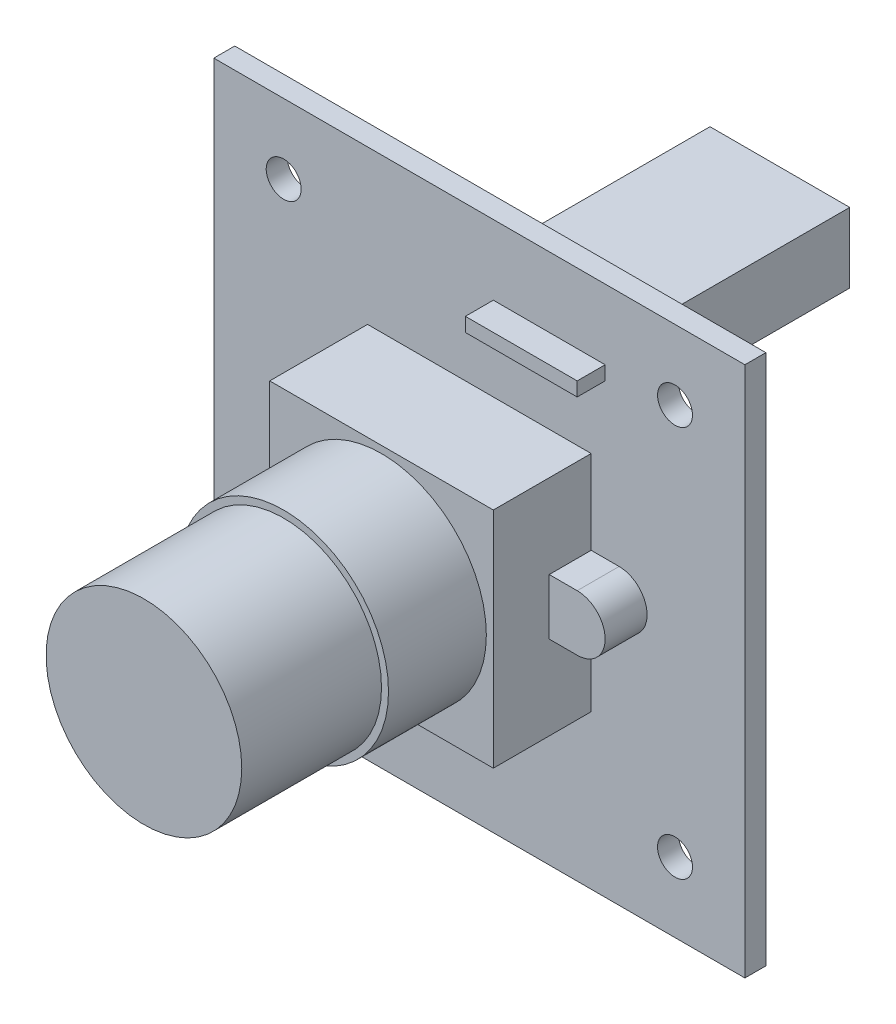
ISO-10303-21;
HEADER;
FILE_DESCRIPTION(('STEP AP214'),'2;1');
FILE_NAME('part.step','',(''),(''),'','','');
FILE_SCHEMA(('AUTOMOTIVE_DESIGN { 1 0 10303 214 1 1 1 1 }'));
ENDSEC;
DATA;
#1=APPLICATION_CONTEXT('core data for automotive mechanical design processes');
#2=APPLICATION_PROTOCOL_DEFINITION('international standard','automotive_design',2000,#1);
#3=PRODUCT_CONTEXT('',#1,'mechanical');
#4=PRODUCT('Part','Part','',(#3));
#5=PRODUCT_RELATED_PRODUCT_CATEGORY('part','',(#4));
#6=PRODUCT_DEFINITION_FORMATION('','',#4);
#7=PRODUCT_DEFINITION_CONTEXT('part definition',#1,'design');
#8=PRODUCT_DEFINITION('design','',#6,#7);
#9=PRODUCT_DEFINITION_SHAPE('','',#8);
#10=(LENGTH_UNIT() NAMED_UNIT(*) SI_UNIT(.MILLI.,.METRE.));
#11=(NAMED_UNIT(*) PLANE_ANGLE_UNIT() SI_UNIT($,.RADIAN.));
#12=(NAMED_UNIT(*) SI_UNIT($,.STERADIAN.) SOLID_ANGLE_UNIT());
#13=UNCERTAINTY_MEASURE_WITH_UNIT(LENGTH_MEASURE(1.E-05),#10,'distance_accuracy_value','');
#14=(GEOMETRIC_REPRESENTATION_CONTEXT(3) GLOBAL_UNCERTAINTY_ASSIGNED_CONTEXT((#13)) GLOBAL_UNIT_ASSIGNED_CONTEXT((#10,
#11,#12)) REPRESENTATION_CONTEXT('',''));
#15=CARTESIAN_POINT('',(0.,0.,0.));
#16=DIRECTION('',(0.,0.,1.));
#17=DIRECTION('',(1.,0.,0.));
#18=AXIS2_PLACEMENT_3D('',#15,#16,#17);
#19=CARTESIAN_POINT('',(0.,0.,1.5));
#20=DIRECTION('',(0.,0.,-1.));
#21=DIRECTION('',(-1.,0.,0.));
#22=AXIS2_PLACEMENT_3D('',#19,#20,#21);
#23=PLANE('',#22);
#24=DIRECTION('',(-1.,0.,0.));
#25=VECTOR('',#24,1.);
#26=CARTESIAN_POINT('',(10.,2.,1.5));
#27=LINE('',#26,#25);
#28=CARTESIAN_POINT('',(-8.,2.,1.5));
#29=VERTEX_POINT('',#28);
#30=CARTESIAN_POINT('',(-10.,2.,1.5));
#31=VERTEX_POINT('',#30);
#32=EDGE_CURVE('E272',#29,#31,#27,.T.);
#33=ORIENTED_EDGE('',*,*,#32,.F.);
#34=DIRECTION('',(0.,-1.,0.));
#35=VECTOR('',#34,1.);
#36=CARTESIAN_POINT('',(-8.,-8.,1.5));
#37=LINE('',#36,#35);
#38=CARTESIAN_POINT('',(-8.,8.,1.5));
#39=VERTEX_POINT('',#38);
#40=EDGE_CURVE('E315',#39,#29,#37,.T.);
#41=ORIENTED_EDGE('',*,*,#40,.F.);
#42=DIRECTION('',(-1.,0.,0.));
#43=VECTOR('',#42,1.);
#44=CARTESIAN_POINT('',(8.,8.,1.5));
#45=LINE('',#44,#43);
#46=CARTESIAN_POINT('',(8.,8.,1.5));
#47=VERTEX_POINT('',#46);
#48=EDGE_CURVE('E308',#47,#39,#45,.T.);
#49=ORIENTED_EDGE('',*,*,#48,.F.);
#50=DIRECTION('',(0.,1.,0.));
#51=VECTOR('',#50,1.);
#52=CARTESIAN_POINT('',(8.,-8.,1.5));
#53=LINE('',#52,#51);
#54=CARTESIAN_POINT('',(8.,2.,1.5));
#55=VERTEX_POINT('',#54);
#56=EDGE_CURVE('E321',#55,#47,#53,.T.);
#57=ORIENTED_EDGE('',*,*,#56,.F.);
#58=CARTESIAN_POINT('',(10.,2.,1.5));
#59=VERTEX_POINT('',#58);
#60=EDGE_CURVE('E273',#59,#55,#27,.T.);
#61=ORIENTED_EDGE('',*,*,#60,.F.);
#62=CARTESIAN_POINT('',(10.,0.,1.5));
#63=DIRECTION('',(0.,0.,1.));
#64=DIRECTION('',(1.,0.,0.));
#65=AXIS2_PLACEMENT_3D('',#62,#63,#64);
#66=CIRCLE('',#65,2.);
#67=CARTESIAN_POINT('',(10.,-2.,1.5));
#68=VERTEX_POINT('',#67);
#69=EDGE_CURVE('E256',#68,#59,#66,.T.);
#70=ORIENTED_EDGE('',*,*,#69,.F.);
#71=DIRECTION('',(1.,0.,0.));
#72=VECTOR('',#71,1.);
#73=CARTESIAN_POINT('',(10.,-2.,1.5));
#74=LINE('',#73,#72);
#75=CARTESIAN_POINT('',(8.,-2.,1.5));
#76=VERTEX_POINT('',#75);
#77=EDGE_CURVE('E277',#76,#68,#74,.T.);
#78=ORIENTED_EDGE('',*,*,#77,.F.);
#79=CARTESIAN_POINT('',(8.,-8.,1.5));
#80=VERTEX_POINT('',#79);
#81=EDGE_CURVE('E322',#80,#76,#53,.T.);
#82=ORIENTED_EDGE('',*,*,#81,.F.);
#83=DIRECTION('',(1.,0.,0.));
#84=VECTOR('',#83,1.);
#85=CARTESIAN_POINT('',(8.,-8.,1.5));
#86=LINE('',#85,#84);
#87=CARTESIAN_POINT('',(-8.,-8.,1.5));
#88=VERTEX_POINT('',#87);
#89=EDGE_CURVE('E318',#88,#80,#86,.T.);
#90=ORIENTED_EDGE('',*,*,#89,.F.);
#91=CARTESIAN_POINT('',(-8.,-2.,1.5));
#92=VERTEX_POINT('',#91);
#93=EDGE_CURVE('E301',#92,#88,#37,.T.);
#94=ORIENTED_EDGE('',*,*,#93,.F.);
#95=CARTESIAN_POINT('',(-10.,-2.,1.5));
#96=VERTEX_POINT('',#95);
#97=EDGE_CURVE('E261',#96,#92,#74,.T.);
#98=ORIENTED_EDGE('',*,*,#97,.F.);
#99=CARTESIAN_POINT('',(-10.,0.,1.5));
#100=DIRECTION('',(0.,0.,1.));
#101=DIRECTION('',(1.,0.,0.));
#102=AXIS2_PLACEMENT_3D('',#99,#100,#101);
#103=CIRCLE('',#102,2.);
#104=EDGE_CURVE('E275',#31,#96,#103,.T.);
#105=ORIENTED_EDGE('',*,*,#104,.F.);
#106=EDGE_LOOP('',(#33,#41,#49,#57,#61,#70,#78,#82,#90,#94,#98,#105));
#107=FACE_BOUND('',#106,.T.);
#108=DIRECTION('',(0.,1.,0.));
#109=VECTOR('',#108,1.);
#110=CARTESIAN_POINT('',(19.,-19.,1.5));
#111=LINE('',#110,#109);
#112=CARTESIAN_POINT('',(19.,-19.,1.5));
#113=VERTEX_POINT('',#112);
#114=CARTESIAN_POINT('',(19.,19.,1.5));
#115=VERTEX_POINT('',#114);
#116=EDGE_CURVE('E363',#113,#115,#111,.T.);
#117=ORIENTED_EDGE('',*,*,#116,.T.);
#118=DIRECTION('',(-1.,0.,0.));
#119=VECTOR('',#118,1.);
#120=CARTESIAN_POINT('',(-19.,19.,1.5));
#121=LINE('',#120,#119);
#122=CARTESIAN_POINT('',(-19.,19.,1.5));
#123=VERTEX_POINT('',#122);
#124=EDGE_CURVE('E366',#115,#123,#121,.T.);
#125=ORIENTED_EDGE('',*,*,#124,.T.);
#126=DIRECTION('',(0.,-1.,0.));
#127=VECTOR('',#126,1.);
#128=CARTESIAN_POINT('',(-19.,-19.,1.5));
#129=LINE('',#128,#127);
#130=CARTESIAN_POINT('',(-19.,-19.,1.5));
#131=VERTEX_POINT('',#130);
#132=EDGE_CURVE('E369',#123,#131,#129,.T.);
#133=ORIENTED_EDGE('',*,*,#132,.T.);
#134=DIRECTION('',(1.,0.,0.));
#135=VECTOR('',#134,1.);
#136=CARTESIAN_POINT('',(-19.,-19.,1.5));
#137=LINE('',#136,#135);
#138=EDGE_CURVE('E371',#131,#113,#137,.T.);
#139=ORIENTED_EDGE('',*,*,#138,.T.);
#140=EDGE_LOOP('',(#117,#125,#133,#139));
#141=FACE_BOUND('',#140,.T.);
#142=CARTESIAN_POINT('',(-14.,14.,1.5));
#143=DIRECTION('',(0.,0.,1.));
#144=DIRECTION('',(1.,0.,0.));
#145=AXIS2_PLACEMENT_3D('',#142,#143,#144);
#146=CIRCLE('',#145,1.25);
#147=CARTESIAN_POINT('',(-12.75,14.,1.5));
#148=VERTEX_POINT('',#147);
#149=EDGE_CURVE('E357',#148,#148,#146,.T.);
#150=ORIENTED_EDGE('',*,*,#149,.F.);
#151=EDGE_LOOP('',(#150));
#152=FACE_BOUND('',#151,.T.);
#153=CARTESIAN_POINT('',(14.,14.,1.5));
#154=DIRECTION('',(0.,0.,1.));
#155=DIRECTION('',(1.,0.,0.));
#156=AXIS2_PLACEMENT_3D('',#153,#154,#155);
#157=CIRCLE('',#156,1.25);
#158=CARTESIAN_POINT('',(15.25,14.,1.5));
#159=VERTEX_POINT('',#158);
#160=EDGE_CURVE('E351',#159,#159,#157,.T.);
#161=ORIENTED_EDGE('',*,*,#160,.F.);
#162=EDGE_LOOP('',(#161));
#163=FACE_BOUND('',#162,.T.);
#164=CARTESIAN_POINT('',(14.,-14.,1.5));
#165=DIRECTION('',(0.,0.,1.));
#166=DIRECTION('',(1.,0.,0.));
#167=AXIS2_PLACEMENT_3D('',#164,#165,#166);
#168=CIRCLE('',#167,1.25);
#169=CARTESIAN_POINT('',(15.25,-14.,1.5));
#170=VERTEX_POINT('',#169);
#171=EDGE_CURVE('E345',#170,#170,#168,.T.);
#172=ORIENTED_EDGE('',*,*,#171,.F.);
#173=EDGE_LOOP('',(#172));
#174=FACE_BOUND('',#173,.T.);
#175=CARTESIAN_POINT('',(-14.,-14.,1.5));
#176=DIRECTION('',(0.,0.,1.));
#177=DIRECTION('',(1.,0.,0.));
#178=AXIS2_PLACEMENT_3D('',#175,#176,#177);
#179=CIRCLE('',#178,1.25);
#180=CARTESIAN_POINT('',(-12.75,-14.,1.5));
#181=VERTEX_POINT('',#180);
#182=EDGE_CURVE('E339',#181,#181,#179,.T.);
#183=ORIENTED_EDGE('',*,*,#182,.F.);
#184=EDGE_LOOP('',(#183));
#185=FACE_BOUND('',#184,.T.);
#186=DIRECTION('',(0.,-1.,0.));
#187=VECTOR('',#186,1.);
#188=CARTESIAN_POINT('',(1.00000000000001,14.,1.5));
#189=LINE('',#188,#187);
#190=CARTESIAN_POINT('',(1.00000000000001,14.,1.5));
#191=VERTEX_POINT('',#190);
#192=CARTESIAN_POINT('',(1.00000000000001,13.,1.5));
#193=VERTEX_POINT('',#192);
#194=EDGE_CURVE('E218',#191,#193,#189,.T.);
#195=ORIENTED_EDGE('',*,*,#194,.F.);
#196=DIRECTION('',(-1.,0.,0.));
#197=VECTOR('',#196,1.);
#198=CARTESIAN_POINT('',(9.00000000000001,14.,1.5));
#199=LINE('',#198,#197);
#200=CARTESIAN_POINT('',(9.00000000000001,14.,1.5));
#201=VERTEX_POINT('',#200);
#202=EDGE_CURVE('E215',#201,#191,#199,.T.);
#203=ORIENTED_EDGE('',*,*,#202,.F.);
#204=DIRECTION('',(0.,1.,0.));
#205=VECTOR('',#204,1.);
#206=CARTESIAN_POINT('',(9.00000000000001,14.,1.5));
#207=LINE('',#206,#205);
#208=CARTESIAN_POINT('',(9.00000000000001,13.,1.5));
#209=VERTEX_POINT('',#208);
#210=EDGE_CURVE('E57',#209,#201,#207,.T.);
#211=ORIENTED_EDGE('',*,*,#210,.F.);
#212=DIRECTION('',(1.,0.,0.));
#213=VECTOR('',#212,1.);
#214=CARTESIAN_POINT('',(9.00000000000001,13.,1.5));
#215=LINE('',#214,#213);
#216=EDGE_CURVE('E52',#193,#209,#215,.T.);
#217=ORIENTED_EDGE('',*,*,#216,.F.);
#218=EDGE_LOOP('',(#195,#203,#211,#217));
#219=FACE_BOUND('',#218,.T.);
#220=ADVANCED_FACE('F36',(#107,#141,#152,#163,#174,#185,#219),#23,.F.);
#221=CARTESIAN_POINT('',(0.,0.,0.));
#222=DIRECTION('',(0.,0.,-1.));
#223=DIRECTION('',(-1.,0.,0.));
#224=AXIS2_PLACEMENT_3D('',#221,#222,#223);
#225=PLANE('',#224);
#226=CARTESIAN_POINT('',(14.,-14.,0.));
#227=DIRECTION('',(0.,0.,1.));
#228=DIRECTION('',(1.,0.,0.));
#229=AXIS2_PLACEMENT_3D('',#226,#227,#228);
#230=CIRCLE('',#229,1.25);
#231=CARTESIAN_POINT('',(15.25,-14.,0.));
#232=VERTEX_POINT('',#231);
#233=EDGE_CURVE('E342',#232,#232,#230,.T.);
#234=ORIENTED_EDGE('',*,*,#233,.T.);
#235=EDGE_LOOP('',(#234));
#236=FACE_BOUND('',#235,.T.);
#237=CARTESIAN_POINT('',(-14.,14.,0.));
#238=DIRECTION('',(0.,0.,1.));
#239=DIRECTION('',(1.,0.,0.));
#240=AXIS2_PLACEMENT_3D('',#237,#238,#239);
#241=CIRCLE('',#240,1.25);
#242=CARTESIAN_POINT('',(-12.75,14.,0.));
#243=VERTEX_POINT('',#242);
#244=EDGE_CURVE('E354',#243,#243,#241,.T.);
#245=ORIENTED_EDGE('',*,*,#244,.T.);
#246=EDGE_LOOP('',(#245));
#247=FACE_BOUND('',#246,.T.);
#248=DIRECTION('',(0.,1.,0.));
#249=VECTOR('',#248,1.);
#250=CARTESIAN_POINT('',(19.,-19.,0.));
#251=LINE('',#250,#249);
#252=CARTESIAN_POINT('',(19.,-19.,0.));
#253=VERTEX_POINT('',#252);
#254=CARTESIAN_POINT('',(19.,19.,0.));
#255=VERTEX_POINT('',#254);
#256=EDGE_CURVE('E360',#253,#255,#251,.T.);
#257=ORIENTED_EDGE('',*,*,#256,.F.);
#258=DIRECTION('',(1.,0.,0.));
#259=VECTOR('',#258,1.);
#260=CARTESIAN_POINT('',(-19.,-19.,0.));
#261=LINE('',#260,#259);
#262=CARTESIAN_POINT('',(-19.,-19.,0.));
#263=VERTEX_POINT('',#262);
#264=EDGE_CURVE('E367',#263,#253,#261,.T.);
#265=ORIENTED_EDGE('',*,*,#264,.F.);
#266=DIRECTION('',(0.,-1.,0.));
#267=VECTOR('',#266,1.);
#268=CARTESIAN_POINT('',(-19.,-19.,0.));
#269=LINE('',#268,#267);
#270=CARTESIAN_POINT('',(-19.,19.,0.));
#271=VERTEX_POINT('',#270);
#272=EDGE_CURVE('E378',#271,#263,#269,.T.);
#273=ORIENTED_EDGE('',*,*,#272,.F.);
#274=DIRECTION('',(-1.,0.,0.));
#275=VECTOR('',#274,1.);
#276=CARTESIAN_POINT('',(-19.,19.,0.));
#277=LINE('',#276,#275);
#278=EDGE_CURVE('E376',#255,#271,#277,.T.);
#279=ORIENTED_EDGE('',*,*,#278,.F.);
#280=EDGE_LOOP('',(#257,#265,#273,#279));
#281=FACE_BOUND('',#280,.T.);
#282=CARTESIAN_POINT('',(14.,14.,0.));
#283=DIRECTION('',(0.,0.,1.));
#284=DIRECTION('',(1.,0.,0.));
#285=AXIS2_PLACEMENT_3D('',#282,#283,#284);
#286=CIRCLE('',#285,1.25);
#287=CARTESIAN_POINT('',(15.25,14.,0.));
#288=VERTEX_POINT('',#287);
#289=EDGE_CURVE('E348',#288,#288,#286,.T.);
#290=ORIENTED_EDGE('',*,*,#289,.T.);
#291=EDGE_LOOP('',(#290));
#292=FACE_BOUND('',#291,.T.);
#293=CARTESIAN_POINT('',(-14.,-14.,0.));
#294=DIRECTION('',(0.,0.,1.));
#295=DIRECTION('',(1.,0.,0.));
#296=AXIS2_PLACEMENT_3D('',#293,#294,#295);
#297=CIRCLE('',#296,1.25);
#298=CARTESIAN_POINT('',(-12.75,-14.,0.));
#299=VERTEX_POINT('',#298);
#300=EDGE_CURVE('E338',#299,#299,#297,.T.);
#301=ORIENTED_EDGE('',*,*,#300,.T.);
#302=EDGE_LOOP('',(#301));
#303=FACE_BOUND('',#302,.T.);
#304=DIRECTION('',(-1.,0.,0.));
#305=VECTOR('',#304,1.);
#306=CARTESIAN_POINT('',(10.,11.,0.));
#307=LINE('',#306,#305);
#308=CARTESIAN_POINT('',(10.,11.,0.));
#309=VERTEX_POINT('',#308);
#310=CARTESIAN_POINT('',(0.,11.,0.));
#311=VERTEX_POINT('',#310);
#312=EDGE_CURVE('E241',#309,#311,#307,.T.);
#313=ORIENTED_EDGE('',*,*,#312,.F.);
#314=DIRECTION('',(0.,-1.,0.));
#315=VECTOR('',#314,1.);
#316=CARTESIAN_POINT('',(10.,11.,0.));
#317=LINE('',#316,#315);
#318=CARTESIAN_POINT('',(10.,16.,0.));
#319=VERTEX_POINT('',#318);
#320=EDGE_CURVE('E222',#319,#309,#317,.T.);
#321=ORIENTED_EDGE('',*,*,#320,.F.);
#322=DIRECTION('',(1.,0.,0.));
#323=VECTOR('',#322,1.);
#324=CARTESIAN_POINT('',(10.,16.,0.));
#325=LINE('',#324,#323);
#326=CARTESIAN_POINT('',(0.,16.,0.));
#327=VERTEX_POINT('',#326);
#328=EDGE_CURVE('E232',#327,#319,#325,.T.);
#329=ORIENTED_EDGE('',*,*,#328,.F.);
#330=DIRECTION('',(0.,1.,0.));
#331=VECTOR('',#330,1.);
#332=CARTESIAN_POINT('',(0.,11.,0.));
#333=LINE('',#332,#331);
#334=EDGE_CURVE('E243',#311,#327,#333,.T.);
#335=ORIENTED_EDGE('',*,*,#334,.F.);
#336=EDGE_LOOP('',(#313,#321,#329,#335));
#337=FACE_BOUND('',#336,.T.);
#338=ADVANCED_FACE('F467',(#236,#247,#281,#292,#303,#337),#225,.T.);
#339=CARTESIAN_POINT('',(-8.,-8.,8.5));
#340=DIRECTION('',(1.,0.,0.));
#341=DIRECTION('',(0.,0.,-1.));
#342=AXIS2_PLACEMENT_3D('',#339,#340,#341);
#343=PLANE('',#342);
#344=DIRECTION('',(0.,0.,-1.));
#345=VECTOR('',#344,1.);
#346=CARTESIAN_POINT('',(-8.,2.,8.5));
#347=LINE('',#346,#345);
#348=CARTESIAN_POINT('',(-8.,2.,4.5));
#349=VERTEX_POINT('',#348);
#350=EDGE_CURVE('E295',#349,#29,#347,.T.);
#351=ORIENTED_EDGE('',*,*,#350,.F.);
#352=DIRECTION('',(0.,-1.,0.));
#353=VECTOR('',#352,1.);
#354=CARTESIAN_POINT('',(-8.,-8.,4.5));
#355=LINE('',#354,#353);
#356=CARTESIAN_POINT('',(-8.,-2.,4.5));
#357=VERTEX_POINT('',#356);
#358=EDGE_CURVE('E289',#349,#357,#355,.T.);
#359=ORIENTED_EDGE('',*,*,#358,.T.);
#360=DIRECTION('',(0.,0.,1.));
#361=VECTOR('',#360,1.);
#362=CARTESIAN_POINT('',(-8.,-2.,8.5));
#363=LINE('',#362,#361);
#364=EDGE_CURVE('E292',#92,#357,#363,.T.);
#365=ORIENTED_EDGE('',*,*,#364,.F.);
#366=ORIENTED_EDGE('',*,*,#93,.T.);
#367=DIRECTION('',(0.,0.,-1.));
#368=VECTOR('',#367,1.);
#369=CARTESIAN_POINT('',(-8.,-8.,8.5));
#370=LINE('',#369,#368);
#371=CARTESIAN_POINT('',(-8.,-8.,8.5));
#372=VERTEX_POINT('',#371);
#373=EDGE_CURVE('E335',#372,#88,#370,.T.);
#374=ORIENTED_EDGE('',*,*,#373,.F.);
#375=DIRECTION('',(0.,-1.,0.));
#376=VECTOR('',#375,1.);
#377=CARTESIAN_POINT('',(-8.,-8.,8.5));
#378=LINE('',#377,#376);
#379=CARTESIAN_POINT('',(-8.,8.,8.5));
#380=VERTEX_POINT('',#379);
#381=EDGE_CURVE('E304',#380,#372,#378,.T.);
#382=ORIENTED_EDGE('',*,*,#381,.F.);
#383=DIRECTION('',(0.,0.,-1.));
#384=VECTOR('',#383,1.);
#385=CARTESIAN_POINT('',(-8.,8.,8.5));
#386=LINE('',#385,#384);
#387=EDGE_CURVE('E314',#380,#39,#386,.T.);
#388=ORIENTED_EDGE('',*,*,#387,.T.);
#389=ORIENTED_EDGE('',*,*,#40,.T.);
#390=EDGE_LOOP('',(#351,#359,#365,#366,#374,#382,#388,#389));
#391=FACE_BOUND('',#390,.T.);
#392=ADVANCED_FACE('F438',(#391),#343,.F.);
#393=CARTESIAN_POINT('',(8.,-8.,8.5));
#394=DIRECTION('',(-1.,0.,0.));
#395=DIRECTION('',(0.,0.,1.));
#396=AXIS2_PLACEMENT_3D('',#393,#394,#395);
#397=PLANE('',#396);
#398=DIRECTION('',(0.,0.,1.));
#399=VECTOR('',#398,1.);
#400=CARTESIAN_POINT('',(8.,2.,8.5));
#401=LINE('',#400,#399);
#402=CARTESIAN_POINT('',(8.,2.,4.5));
#403=VERTEX_POINT('',#402);
#404=EDGE_CURVE('E40',#55,#403,#401,.T.);
#405=ORIENTED_EDGE('',*,*,#404,.F.);
#406=ORIENTED_EDGE('',*,*,#56,.T.);
#407=DIRECTION('',(0.,0.,-1.));
#408=VECTOR('',#407,1.);
#409=CARTESIAN_POINT('',(8.,8.,8.5));
#410=LINE('',#409,#408);
#411=CARTESIAN_POINT('',(8.,8.,8.5));
#412=VERTEX_POINT('',#411);
#413=EDGE_CURVE('E329',#412,#47,#410,.T.);
#414=ORIENTED_EDGE('',*,*,#413,.F.);
#415=DIRECTION('',(0.,1.,0.));
#416=VECTOR('',#415,1.);
#417=CARTESIAN_POINT('',(8.,-8.,8.5));
#418=LINE('',#417,#416);
#419=CARTESIAN_POINT('',(8.,-8.,8.5));
#420=VERTEX_POINT('',#419);
#421=EDGE_CURVE('E310',#420,#412,#418,.T.);
#422=ORIENTED_EDGE('',*,*,#421,.F.);
#423=DIRECTION('',(0.,0.,-1.));
#424=VECTOR('',#423,1.);
#425=CARTESIAN_POINT('',(8.,-8.,8.5));
#426=LINE('',#425,#424);
#427=EDGE_CURVE('E332',#420,#80,#426,.T.);
#428=ORIENTED_EDGE('',*,*,#427,.T.);
#429=ORIENTED_EDGE('',*,*,#81,.T.);
#430=DIRECTION('',(0.,0.,-1.));
#431=VECTOR('',#430,1.);
#432=CARTESIAN_POINT('',(8.,-2.,8.5));
#433=LINE('',#432,#431);
#434=CARTESIAN_POINT('',(8.,-2.,4.5));
#435=VERTEX_POINT('',#434);
#436=EDGE_CURVE('E394',#435,#76,#433,.T.);
#437=ORIENTED_EDGE('',*,*,#436,.F.);
#438=DIRECTION('',(0.,1.,0.));
#439=VECTOR('',#438,1.);
#440=CARTESIAN_POINT('',(8.,-8.,4.5));
#441=LINE('',#440,#439);
#442=EDGE_CURVE('E392',#435,#403,#441,.T.);
#443=ORIENTED_EDGE('',*,*,#442,.T.);
#444=EDGE_LOOP('',(#405,#406,#414,#422,#428,#429,#437,#443));
#445=FACE_BOUND('',#444,.T.);
#446=ADVANCED_FACE('F406',(#445),#397,.F.);
#447=CARTESIAN_POINT('',(19.,-19.,1.5));
#448=DIRECTION('',(-1.,0.,0.));
#449=DIRECTION('',(0.,0.,1.));
#450=AXIS2_PLACEMENT_3D('',#447,#448,#449);
#451=PLANE('',#450);
#452=ORIENTED_EDGE('',*,*,#256,.T.);
#453=DIRECTION('',(0.,0.,-1.));
#454=VECTOR('',#453,1.);
#455=CARTESIAN_POINT('',(19.,19.,1.5));
#456=LINE('',#455,#454);
#457=EDGE_CURVE('E389',#115,#255,#456,.T.);
#458=ORIENTED_EDGE('',*,*,#457,.F.);
#459=ORIENTED_EDGE('',*,*,#116,.F.);
#460=DIRECTION('',(0.,0.,-1.));
#461=VECTOR('',#460,1.);
#462=CARTESIAN_POINT('',(19.,-19.,1.5));
#463=LINE('',#462,#461);
#464=EDGE_CURVE('E373',#113,#253,#463,.T.);
#465=ORIENTED_EDGE('',*,*,#464,.T.);
#466=EDGE_LOOP('',(#452,#458,#459,#465));
#467=FACE_BOUND('',#466,.T.);
#468=ADVANCED_FACE('F38',(#467),#451,.F.);
#469=CARTESIAN_POINT('',(-19.,19.,1.5));
#470=DIRECTION('',(0.,-1.,0.));
#471=DIRECTION('',(0.,0.,-1.));
#472=AXIS2_PLACEMENT_3D('',#469,#470,#471);
#473=PLANE('',#472);
#474=ORIENTED_EDGE('',*,*,#278,.T.);
#475=DIRECTION('',(0.,0.,-1.));
#476=VECTOR('',#475,1.);
#477=CARTESIAN_POINT('',(-19.,19.,1.5));
#478=LINE('',#477,#476);
#479=EDGE_CURVE('E386',#123,#271,#478,.T.);
#480=ORIENTED_EDGE('',*,*,#479,.F.);
#481=ORIENTED_EDGE('',*,*,#124,.F.);
#482=ORIENTED_EDGE('',*,*,#457,.T.);
#483=EDGE_LOOP('',(#474,#480,#481,#482));
#484=FACE_BOUND('',#483,.T.);
#485=ADVANCED_FACE('F484',(#484),#473,.F.);
#486=CARTESIAN_POINT('',(-19.,-19.,1.5));
#487=DIRECTION('',(1.,0.,0.));
#488=DIRECTION('',(0.,0.,-1.));
#489=AXIS2_PLACEMENT_3D('',#486,#487,#488);
#490=PLANE('',#489);
#491=ORIENTED_EDGE('',*,*,#272,.T.);
#492=DIRECTION('',(0.,0.,-1.));
#493=VECTOR('',#492,1.);
#494=CARTESIAN_POINT('',(-19.,-19.,1.5));
#495=LINE('',#494,#493);
#496=EDGE_CURVE('E383',#131,#263,#495,.T.);
#497=ORIENTED_EDGE('',*,*,#496,.F.);
#498=ORIENTED_EDGE('',*,*,#132,.F.);
#499=ORIENTED_EDGE('',*,*,#479,.T.);
#500=EDGE_LOOP('',(#491,#497,#498,#499));
#501=FACE_BOUND('',#500,.T.);
#502=ADVANCED_FACE('F481',(#501),#490,.F.);
#503=CARTESIAN_POINT('',(-19.,-19.,1.5));
#504=DIRECTION('',(0.,1.,0.));
#505=DIRECTION('',(0.,0.,1.));
#506=AXIS2_PLACEMENT_3D('',#503,#504,#505);
#507=PLANE('',#506);
#508=ORIENTED_EDGE('',*,*,#264,.T.);
#509=ORIENTED_EDGE('',*,*,#464,.F.);
#510=ORIENTED_EDGE('',*,*,#138,.F.);
#511=ORIENTED_EDGE('',*,*,#496,.T.);
#512=EDGE_LOOP('',(#508,#509,#510,#511));
#513=FACE_BOUND('',#512,.T.);
#514=ADVANCED_FACE('F478',(#513),#507,.F.);
#515=CARTESIAN_POINT('',(-14.,14.,1.5));
#516=DIRECTION('',(0.,0.,-1.));
#517=DIRECTION('',(-1.,0.,0.));
#518=AXIS2_PLACEMENT_3D('',#515,#516,#517);
#519=CYLINDRICAL_SURFACE('',#518,1.25);
#520=ORIENTED_EDGE('',*,*,#149,.T.);
#521=EDGE_LOOP('',(#520));
#522=FACE_BOUND('',#521,.T.);
#523=ORIENTED_EDGE('',*,*,#244,.F.);
#524=EDGE_LOOP('',(#523));
#525=FACE_BOUND('',#524,.T.);
#526=ADVANCED_FACE('F475',(#522,#525),#519,.F.);
#527=CARTESIAN_POINT('',(14.,14.,1.5));
#528=DIRECTION('',(0.,0.,-1.));
#529=DIRECTION('',(-1.,0.,0.));
#530=AXIS2_PLACEMENT_3D('',#527,#528,#529);
#531=CYLINDRICAL_SURFACE('',#530,1.25);
#532=ORIENTED_EDGE('',*,*,#160,.T.);
#533=EDGE_LOOP('',(#532));
#534=FACE_BOUND('',#533,.T.);
#535=ORIENTED_EDGE('',*,*,#289,.F.);
#536=EDGE_LOOP('',(#535));
#537=FACE_BOUND('',#536,.T.);
#538=ADVANCED_FACE('F802',(#534,#537),#531,.F.);
#539=CARTESIAN_POINT('',(14.,-14.,1.5));
#540=DIRECTION('',(0.,0.,-1.));
#541=DIRECTION('',(-1.,0.,0.));
#542=AXIS2_PLACEMENT_3D('',#539,#540,#541);
#543=CYLINDRICAL_SURFACE('',#542,1.25);
#544=ORIENTED_EDGE('',*,*,#171,.T.);
#545=EDGE_LOOP('',(#544));
#546=FACE_BOUND('',#545,.T.);
#547=ORIENTED_EDGE('',*,*,#233,.F.);
#548=EDGE_LOOP('',(#547));
#549=FACE_BOUND('',#548,.T.);
#550=ADVANCED_FACE('F793',(#546,#549),#543,.F.);
#551=CARTESIAN_POINT('',(-14.,-14.,1.5));
#552=DIRECTION('',(0.,0.,-1.));
#553=DIRECTION('',(-1.,0.,0.));
#554=AXIS2_PLACEMENT_3D('',#551,#552,#553);
#555=CYLINDRICAL_SURFACE('',#554,1.25);
#556=ORIENTED_EDGE('',*,*,#182,.T.);
#557=EDGE_LOOP('',(#556));
#558=FACE_BOUND('',#557,.T.);
#559=ORIENTED_EDGE('',*,*,#300,.F.);
#560=EDGE_LOOP('',(#559));
#561=FACE_BOUND('',#560,.T.);
#562=ADVANCED_FACE('F784',(#558,#561),#555,.F.);
#563=CARTESIAN_POINT('',(8.,-8.,8.5));
#564=DIRECTION('',(0.,1.,0.));
#565=DIRECTION('',(0.,0.,1.));
#566=AXIS2_PLACEMENT_3D('',#563,#564,#565);
#567=PLANE('',#566);
#568=ORIENTED_EDGE('',*,*,#89,.T.);
#569=ORIENTED_EDGE('',*,*,#427,.F.);
#570=DIRECTION('',(1.,0.,0.));
#571=VECTOR('',#570,1.);
#572=CARTESIAN_POINT('',(8.,-8.,8.5));
#573=LINE('',#572,#571);
#574=EDGE_CURVE('E307',#372,#420,#573,.T.);
#575=ORIENTED_EDGE('',*,*,#574,.F.);
#576=ORIENTED_EDGE('',*,*,#373,.T.);
#577=EDGE_LOOP('',(#568,#569,#575,#576));
#578=FACE_BOUND('',#577,.T.);
#579=ADVANCED_FACE('F432',(#578),#567,.F.);
#580=CARTESIAN_POINT('',(8.,8.,8.5));
#581=DIRECTION('',(0.,-1.,0.));
#582=DIRECTION('',(0.,0.,-1.));
#583=AXIS2_PLACEMENT_3D('',#580,#581,#582);
#584=PLANE('',#583);
#585=ORIENTED_EDGE('',*,*,#48,.T.);
#586=ORIENTED_EDGE('',*,*,#387,.F.);
#587=DIRECTION('',(-1.,0.,0.));
#588=VECTOR('',#587,1.);
#589=CARTESIAN_POINT('',(8.,8.,8.5));
#590=LINE('',#589,#588);
#591=EDGE_CURVE('E312',#412,#380,#590,.T.);
#592=ORIENTED_EDGE('',*,*,#591,.F.);
#593=ORIENTED_EDGE('',*,*,#413,.T.);
#594=EDGE_LOOP('',(#585,#586,#592,#593));
#595=FACE_BOUND('',#594,.T.);
#596=ADVANCED_FACE('F425',(#595),#584,.F.);
#597=CARTESIAN_POINT('',(0.,0.,8.5));
#598=DIRECTION('',(0.,0.,1.));
#599=DIRECTION('',(1.,0.,0.));
#600=AXIS2_PLACEMENT_3D('',#597,#598,#599);
#601=PLANE('',#600);
#602=CARTESIAN_POINT('',(0.,0.,8.5));
#603=DIRECTION('',(0.,0.,1.));
#604=DIRECTION('',(1.,0.,0.));
#605=AXIS2_PLACEMENT_3D('',#602,#603,#604);
#606=CIRCLE('',#605,7.5);
#607=CARTESIAN_POINT('',(7.5,0.,8.5));
#608=VERTEX_POINT('',#607);
#609=EDGE_CURVE('E297',#608,#608,#606,.T.);
#610=ORIENTED_EDGE('',*,*,#609,.F.);
#611=EDGE_LOOP('',(#610));
#612=FACE_BOUND('',#611,.T.);
#613=ORIENTED_EDGE('',*,*,#381,.T.);
#614=ORIENTED_EDGE('',*,*,#574,.T.);
#615=ORIENTED_EDGE('',*,*,#421,.T.);
#616=ORIENTED_EDGE('',*,*,#591,.T.);
#617=EDGE_LOOP('',(#613,#614,#615,#616));
#618=FACE_BOUND('',#617,.T.);
#619=ADVANCED_FACE('F428',(#612,#618),#601,.T.);
#620=CARTESIAN_POINT('',(0.,0.,15.5));
#621=DIRECTION('',(0.,0.,-1.));
#622=DIRECTION('',(-1.,0.,0.));
#623=AXIS2_PLACEMENT_3D('',#620,#621,#622);
#624=CYLINDRICAL_SURFACE('',#623,7.5);
#625=CARTESIAN_POINT('',(0.,0.,15.5));
#626=DIRECTION('',(0.,0.,1.));
#627=DIRECTION('',(1.,0.,0.));
#628=AXIS2_PLACEMENT_3D('',#625,#626,#627);
#629=CIRCLE('',#628,7.5);
#630=CARTESIAN_POINT('',(7.5,0.,15.5));
#631=VERTEX_POINT('',#630);
#632=EDGE_CURVE('E298',#631,#631,#629,.T.);
#633=ORIENTED_EDGE('',*,*,#632,.F.);
#634=EDGE_LOOP('',(#633));
#635=FACE_BOUND('',#634,.T.);
#636=ORIENTED_EDGE('',*,*,#609,.T.);
#637=EDGE_LOOP('',(#636));
#638=FACE_BOUND('',#637,.T.);
#639=ADVANCED_FACE('F749',(#635,#638),#624,.T.);
#640=CARTESIAN_POINT('',(0.,0.,15.5));
#641=DIRECTION('',(0.,0.,1.));
#642=DIRECTION('',(1.,0.,0.));
#643=AXIS2_PLACEMENT_3D('',#640,#641,#642);
#644=PLANE('',#643);
#645=CARTESIAN_POINT('',(0.,0.,15.5));
#646=DIRECTION('',(0.,0.,1.));
#647=DIRECTION('',(1.,0.,0.));
#648=AXIS2_PLACEMENT_3D('',#645,#646,#647);
#649=CIRCLE('',#648,7.);
#650=CARTESIAN_POINT('',(7.,0.,15.5));
#651=VERTEX_POINT('',#650);
#652=EDGE_CURVE('E11',#651,#651,#649,.T.);
#653=ORIENTED_EDGE('',*,*,#652,.F.);
#654=EDGE_LOOP('',(#653));
#655=FACE_BOUND('',#654,.T.);
#656=ORIENTED_EDGE('',*,*,#632,.T.);
#657=EDGE_LOOP('',(#656));
#658=FACE_BOUND('',#657,.T.);
#659=ADVANCED_FACE('F465',(#655,#658),#644,.T.);
#660=CARTESIAN_POINT('',(10.,0.,4.5));
#661=DIRECTION('',(0.,0.,1.));
#662=DIRECTION('',(1.,0.,0.));
#663=AXIS2_PLACEMENT_3D('',#660,#661,#662);
#664=PLANE('',#663);
#665=ORIENTED_EDGE('',*,*,#442,.F.);
#666=DIRECTION('',(1.,0.,0.));
#667=VECTOR('',#666,1.);
#668=CARTESIAN_POINT('',(10.,-2.,4.5));
#669=LINE('',#668,#667);
#670=CARTESIAN_POINT('',(10.,-2.,4.5));
#671=VERTEX_POINT('',#670);
#672=EDGE_CURVE('E266',#435,#671,#669,.T.);
#673=ORIENTED_EDGE('',*,*,#672,.T.);
#674=CARTESIAN_POINT('',(10.,0.,4.5));
#675=DIRECTION('',(0.,0.,1.));
#676=DIRECTION('',(1.,0.,0.));
#677=AXIS2_PLACEMENT_3D('',#674,#675,#676);
#678=CIRCLE('',#677,2.);
#679=CARTESIAN_POINT('',(10.,2.,4.5));
#680=VERTEX_POINT('',#679);
#681=EDGE_CURVE('E257',#671,#680,#678,.T.);
#682=ORIENTED_EDGE('',*,*,#681,.T.);
#683=DIRECTION('',(-1.,0.,0.));
#684=VECTOR('',#683,1.);
#685=CARTESIAN_POINT('',(10.,2.,4.5));
#686=LINE('',#685,#684);
#687=EDGE_CURVE('E262',#680,#403,#686,.T.);
#688=ORIENTED_EDGE('',*,*,#687,.T.);
#689=EDGE_LOOP('',(#665,#673,#682,#688));
#690=FACE_BOUND('',#689,.T.);
#691=ADVANCED_FACE('F408',(#690),#664,.T.);
#692=CARTESIAN_POINT('',(10.,-2.,4.5));
#693=DIRECTION('',(0.,1.,0.));
#694=DIRECTION('',(-1.,0.,0.));
#695=AXIS2_PLACEMENT_3D('',#692,#693,#694);
#696=PLANE('',#695);
#697=ORIENTED_EDGE('',*,*,#672,.F.);
#698=ORIENTED_EDGE('',*,*,#436,.T.);
#699=ORIENTED_EDGE('',*,*,#77,.T.);
#700=DIRECTION('',(0.,0.,-1.));
#701=VECTOR('',#700,1.);
#702=CARTESIAN_POINT('',(10.,-2.,4.5));
#703=LINE('',#702,#701);
#704=EDGE_CURVE('E269',#671,#68,#703,.T.);
#705=ORIENTED_EDGE('',*,*,#704,.F.);
#706=EDGE_LOOP('',(#697,#698,#699,#705));
#707=FACE_BOUND('',#706,.T.);
#708=ADVANCED_FACE('F410',(#707),#696,.F.);
#709=CARTESIAN_POINT('',(10.,2.,4.5));
#710=DIRECTION('',(0.,-1.,0.));
#711=DIRECTION('',(1.,0.,0.));
#712=AXIS2_PLACEMENT_3D('',#709,#710,#711);
#713=PLANE('',#712);
#714=ORIENTED_EDGE('',*,*,#60,.T.);
#715=ORIENTED_EDGE('',*,*,#404,.T.);
#716=ORIENTED_EDGE('',*,*,#687,.F.);
#717=DIRECTION('',(0.,0.,-1.));
#718=VECTOR('',#717,1.);
#719=CARTESIAN_POINT('',(10.,2.,4.5));
#720=LINE('',#719,#718);
#721=EDGE_CURVE('E287',#680,#59,#720,.T.);
#722=ORIENTED_EDGE('',*,*,#721,.T.);
#723=EDGE_LOOP('',(#714,#715,#716,#722));
#724=FACE_BOUND('',#723,.T.);
#725=ADVANCED_FACE('F402',(#724),#713,.F.);
#726=CARTESIAN_POINT('',(10.,0.,4.5));
#727=DIRECTION('',(0.,0.,-1.));
#728=DIRECTION('',(-1.,0.,0.));
#729=AXIS2_PLACEMENT_3D('',#726,#727,#728);
#730=CYLINDRICAL_SURFACE('',#729,2.);
#731=ORIENTED_EDGE('',*,*,#69,.T.);
#732=ORIENTED_EDGE('',*,*,#721,.F.);
#733=ORIENTED_EDGE('',*,*,#681,.F.);
#734=ORIENTED_EDGE('',*,*,#704,.T.);
#735=EDGE_LOOP('',(#731,#732,#733,#734));
#736=FACE_BOUND('',#735,.T.);
#737=ADVANCED_FACE('F415',(#736),#730,.T.);
#738=CARTESIAN_POINT('',(-10.,2.,4.5));
#739=VERTEX_POINT('',#738);
#740=EDGE_CURVE('E260',#349,#739,#686,.T.);
#741=ORIENTED_EDGE('',*,*,#740,.F.);
#742=ORIENTED_EDGE('',*,*,#350,.T.);
#743=ORIENTED_EDGE('',*,*,#32,.T.);
#744=DIRECTION('',(0.,0.,-1.));
#745=VECTOR('',#744,1.);
#746=CARTESIAN_POINT('',(-10.,2.,4.5));
#747=LINE('',#746,#745);
#748=EDGE_CURVE('E284',#739,#31,#747,.T.);
#749=ORIENTED_EDGE('',*,*,#748,.F.);
#750=EDGE_LOOP('',(#741,#742,#743,#749));
#751=FACE_BOUND('',#750,.T.);
#752=ADVANCED_FACE('F451',(#751),#713,.F.);
#753=ORIENTED_EDGE('',*,*,#97,.T.);
#754=ORIENTED_EDGE('',*,*,#364,.T.);
#755=CARTESIAN_POINT('',(-10.,-2.,4.5));
#756=VERTEX_POINT('',#755);
#757=EDGE_CURVE('E267',#756,#357,#669,.T.);
#758=ORIENTED_EDGE('',*,*,#757,.F.);
#759=DIRECTION('',(0.,0.,-1.));
#760=VECTOR('',#759,1.);
#761=CARTESIAN_POINT('',(-10.,-2.,4.5));
#762=LINE('',#761,#760);
#763=EDGE_CURVE('E281',#756,#96,#762,.T.);
#764=ORIENTED_EDGE('',*,*,#763,.T.);
#765=EDGE_LOOP('',(#753,#754,#758,#764));
#766=FACE_BOUND('',#765,.T.);
#767=ADVANCED_FACE('F442',(#766),#696,.F.);
#768=ORIENTED_EDGE('',*,*,#358,.F.);
#769=ORIENTED_EDGE('',*,*,#740,.T.);
#770=CARTESIAN_POINT('',(-10.,0.,4.5));
#771=DIRECTION('',(0.,0.,1.));
#772=DIRECTION('',(1.,0.,0.));
#773=AXIS2_PLACEMENT_3D('',#770,#771,#772);
#774=CIRCLE('',#773,2.);
#775=EDGE_CURVE('E264',#739,#756,#774,.T.);
#776=ORIENTED_EDGE('',*,*,#775,.T.);
#777=ORIENTED_EDGE('',*,*,#757,.T.);
#778=EDGE_LOOP('',(#768,#769,#776,#777));
#779=FACE_BOUND('',#778,.T.);
#780=ADVANCED_FACE('F453',(#779),#664,.T.);
#781=CARTESIAN_POINT('',(-10.,0.,4.5));
#782=DIRECTION('',(0.,0.,-1.));
#783=DIRECTION('',(-1.,0.,0.));
#784=AXIS2_PLACEMENT_3D('',#781,#782,#783);
#785=CYLINDRICAL_SURFACE('',#784,2.);
#786=ORIENTED_EDGE('',*,*,#104,.T.);
#787=ORIENTED_EDGE('',*,*,#763,.F.);
#788=ORIENTED_EDGE('',*,*,#775,.F.);
#789=ORIENTED_EDGE('',*,*,#748,.T.);
#790=EDGE_LOOP('',(#786,#787,#788,#789));
#791=FACE_BOUND('',#790,.T.);
#792=ADVANCED_FACE('F446',(#791),#785,.T.);
#793=CARTESIAN_POINT('',(10.,11.,-15.));
#794=DIRECTION('',(-1.,0.,0.));
#795=DIRECTION('',(0.,-1.,0.));
#796=AXIS2_PLACEMENT_3D('',#793,#794,#795);
#797=PLANE('',#796);
#798=ORIENTED_EDGE('',*,*,#320,.T.);
#799=DIRECTION('',(0.,0.,1.));
#800=VECTOR('',#799,1.);
#801=CARTESIAN_POINT('',(10.,11.,-15.));
#802=LINE('',#801,#800);
#803=CARTESIAN_POINT('',(10.,11.,-15.));
#804=VERTEX_POINT('',#803);
#805=EDGE_CURVE('E254',#804,#309,#802,.T.);
#806=ORIENTED_EDGE('',*,*,#805,.F.);
#807=DIRECTION('',(0.,-1.,0.));
#808=VECTOR('',#807,1.);
#809=CARTESIAN_POINT('',(10.,11.,-15.));
#810=LINE('',#809,#808);
#811=CARTESIAN_POINT('',(10.,16.,-15.));
#812=VERTEX_POINT('',#811);
#813=EDGE_CURVE('E228',#812,#804,#810,.T.);
#814=ORIENTED_EDGE('',*,*,#813,.F.);
#815=DIRECTION('',(0.,0.,1.));
#816=VECTOR('',#815,1.);
#817=CARTESIAN_POINT('',(10.,16.,-15.));
#818=LINE('',#817,#816);
#819=EDGE_CURVE('E238',#812,#319,#818,.T.);
#820=ORIENTED_EDGE('',*,*,#819,.T.);
#821=EDGE_LOOP('',(#798,#806,#814,#820));
#822=FACE_BOUND('',#821,.T.);
#823=ADVANCED_FACE('F460',(#822),#797,.F.);
#824=CARTESIAN_POINT('',(10.,11.,-15.));
#825=DIRECTION('',(0.,1.,0.));
#826=DIRECTION('',(-1.,0.,0.));
#827=AXIS2_PLACEMENT_3D('',#824,#825,#826);
#828=PLANE('',#827);
#829=ORIENTED_EDGE('',*,*,#312,.T.);
#830=DIRECTION('',(0.,0.,1.));
#831=VECTOR('',#830,1.);
#832=CARTESIAN_POINT('',(0.,11.,-15.));
#833=LINE('',#832,#831);
#834=CARTESIAN_POINT('',(0.,11.,-15.));
#835=VERTEX_POINT('',#834);
#836=EDGE_CURVE('E251',#835,#311,#833,.T.);
#837=ORIENTED_EDGE('',*,*,#836,.F.);
#838=DIRECTION('',(-1.,0.,0.));
#839=VECTOR('',#838,1.);
#840=CARTESIAN_POINT('',(10.,11.,-15.));
#841=LINE('',#840,#839);
#842=EDGE_CURVE('E231',#804,#835,#841,.T.);
#843=ORIENTED_EDGE('',*,*,#842,.F.);
#844=ORIENTED_EDGE('',*,*,#805,.T.);
#845=EDGE_LOOP('',(#829,#837,#843,#844));
#846=FACE_BOUND('',#845,.T.);
#847=ADVANCED_FACE('F558',(#846),#828,.F.);
#848=CARTESIAN_POINT('',(0.,11.,-15.));
#849=DIRECTION('',(1.,0.,0.));
#850=DIRECTION('',(0.,0.,-1.));
#851=AXIS2_PLACEMENT_3D('',#848,#849,#850);
#852=PLANE('',#851);
#853=ORIENTED_EDGE('',*,*,#334,.T.);
#854=DIRECTION('',(0.,0.,1.));
#855=VECTOR('',#854,1.);
#856=CARTESIAN_POINT('',(0.,16.,-15.));
#857=LINE('',#856,#855);
#858=CARTESIAN_POINT('',(0.,16.,-15.));
#859=VERTEX_POINT('',#858);
#860=EDGE_CURVE('E249',#859,#327,#857,.T.);
#861=ORIENTED_EDGE('',*,*,#860,.F.);
#862=DIRECTION('',(0.,1.,0.));
#863=VECTOR('',#862,1.);
#864=CARTESIAN_POINT('',(0.,11.,-15.));
#865=LINE('',#864,#863);
#866=EDGE_CURVE('E234',#835,#859,#865,.T.);
#867=ORIENTED_EDGE('',*,*,#866,.F.);
#868=ORIENTED_EDGE('',*,*,#836,.T.);
#869=EDGE_LOOP('',(#853,#861,#867,#868));
#870=FACE_BOUND('',#869,.T.);
#871=ADVANCED_FACE('F554',(#870),#852,.F.);
#872=CARTESIAN_POINT('',(10.,16.,-15.));
#873=DIRECTION('',(0.,-1.,0.));
#874=DIRECTION('',(1.,0.,0.));
#875=AXIS2_PLACEMENT_3D('',#872,#873,#874);
#876=PLANE('',#875);
#877=ORIENTED_EDGE('',*,*,#328,.T.);
#878=ORIENTED_EDGE('',*,*,#819,.F.);
#879=DIRECTION('',(1.,0.,0.));
#880=VECTOR('',#879,1.);
#881=CARTESIAN_POINT('',(10.,16.,-15.));
#882=LINE('',#881,#880);
#883=EDGE_CURVE('E236',#859,#812,#882,.T.);
#884=ORIENTED_EDGE('',*,*,#883,.F.);
#885=ORIENTED_EDGE('',*,*,#860,.T.);
#886=EDGE_LOOP('',(#877,#878,#884,#885));
#887=FACE_BOUND('',#886,.T.);
#888=ADVANCED_FACE('F550',(#887),#876,.F.);
#889=CARTESIAN_POINT('',(0.,0.,-15.));
#890=DIRECTION('',(0.,0.,1.));
#891=DIRECTION('',(1.,0.,0.));
#892=AXIS2_PLACEMENT_3D('',#889,#890,#891);
#893=PLANE('',#892);
#894=ORIENTED_EDGE('',*,*,#813,.T.);
#895=ORIENTED_EDGE('',*,*,#842,.T.);
#896=ORIENTED_EDGE('',*,*,#866,.T.);
#897=ORIENTED_EDGE('',*,*,#883,.T.);
#898=EDGE_LOOP('',(#894,#895,#896,#897));
#899=FACE_BOUND('',#898,.T.);
#900=ADVANCED_FACE('F546',(#899),#893,.F.);
#901=CARTESIAN_POINT('',(0.,0.,25.5));
#902=DIRECTION('',(0.,0.,-1.));
#903=DIRECTION('',(-1.,0.,0.));
#904=AXIS2_PLACEMENT_3D('',#901,#902,#903);
#905=CYLINDRICAL_SURFACE('',#904,7.);
#906=CARTESIAN_POINT('',(0.,0.,25.5));
#907=DIRECTION('',(0.,0.,1.));
#908=DIRECTION('',(1.,0.,0.));
#909=AXIS2_PLACEMENT_3D('',#906,#907,#908);
#910=CIRCLE('',#909,7.);
#911=CARTESIAN_POINT('',(7.,0.,25.5));
#912=VERTEX_POINT('',#911);
#913=EDGE_CURVE('E219',#912,#912,#910,.T.);
#914=ORIENTED_EDGE('',*,*,#913,.F.);
#915=EDGE_LOOP('',(#914));
#916=FACE_BOUND('',#915,.T.);
#917=ORIENTED_EDGE('',*,*,#652,.T.);
#918=EDGE_LOOP('',(#917));
#919=FACE_BOUND('',#918,.T.);
#920=ADVANCED_FACE('F542',(#916,#919),#905,.T.);
#921=CARTESIAN_POINT('',(0.,0.,25.5));
#922=DIRECTION('',(0.,0.,1.));
#923=DIRECTION('',(1.,0.,0.));
#924=AXIS2_PLACEMENT_3D('',#921,#922,#923);
#925=PLANE('',#924);
#926=ORIENTED_EDGE('',*,*,#913,.T.);
#927=EDGE_LOOP('',(#926));
#928=FACE_BOUND('',#927,.T.);
#929=ADVANCED_FACE('F539',(#928),#925,.T.);
#930=CARTESIAN_POINT('',(1.00000000000001,14.,3.5));
#931=DIRECTION('',(1.,0.,0.));
#932=DIRECTION('',(0.,0.,-1.));
#933=AXIS2_PLACEMENT_3D('',#930,#931,#932);
#934=PLANE('',#933);
#935=ORIENTED_EDGE('',*,*,#194,.T.);
#936=DIRECTION('',(0.,0.,-1.));
#937=VECTOR('',#936,1.);
#938=CARTESIAN_POINT('',(1.00000000000001,13.,3.5));
#939=LINE('',#938,#937);
#940=CARTESIAN_POINT('',(1.00000000000001,13.,3.5));
#941=VERTEX_POINT('',#940);
#942=EDGE_CURVE('E199',#941,#193,#939,.T.);
#943=ORIENTED_EDGE('',*,*,#942,.F.);
#944=DIRECTION('',(0.,-1.,0.));
#945=VECTOR('',#944,1.);
#946=CARTESIAN_POINT('',(1.00000000000001,14.,3.5));
#947=LINE('',#946,#945);
#948=CARTESIAN_POINT('',(1.00000000000001,14.,3.5));
#949=VERTEX_POINT('',#948);
#950=EDGE_CURVE('E206',#949,#941,#947,.T.);
#951=ORIENTED_EDGE('',*,*,#950,.F.);
#952=DIRECTION('',(0.,0.,-1.));
#953=VECTOR('',#952,1.);
#954=CARTESIAN_POINT('',(1.00000000000001,14.,3.5));
#955=LINE('',#954,#953);
#956=EDGE_CURVE('E517',#949,#191,#955,.T.);
#957=ORIENTED_EDGE('',*,*,#956,.T.);
#958=EDGE_LOOP('',(#935,#943,#951,#957));
#959=FACE_BOUND('',#958,.T.);
#960=ADVANCED_FACE('F217',(#959),#934,.F.);
#961=CARTESIAN_POINT('',(9.00000000000001,13.,3.5));
#962=DIRECTION('',(0.,1.,0.));
#963=DIRECTION('',(-1.,0.,0.));
#964=AXIS2_PLACEMENT_3D('',#961,#962,#963);
#965=PLANE('',#964);
#966=ORIENTED_EDGE('',*,*,#216,.T.);
#967=DIRECTION('',(0.,0.,-1.));
#968=VECTOR('',#967,1.);
#969=CARTESIAN_POINT('',(9.00000000000001,13.,3.5));
#970=LINE('',#969,#968);
#971=CARTESIAN_POINT('',(9.00000000000001,13.,3.5));
#972=VERTEX_POINT('',#971);
#973=EDGE_CURVE('E202',#972,#209,#970,.T.);
#974=ORIENTED_EDGE('',*,*,#973,.F.);
#975=DIRECTION('',(1.,0.,0.));
#976=VECTOR('',#975,1.);
#977=CARTESIAN_POINT('',(9.00000000000001,13.,3.5));
#978=LINE('',#977,#976);
#979=EDGE_CURVE('E195',#941,#972,#978,.T.);
#980=ORIENTED_EDGE('',*,*,#979,.F.);
#981=ORIENTED_EDGE('',*,*,#942,.T.);
#982=EDGE_LOOP('',(#966,#974,#980,#981));
#983=FACE_BOUND('',#982,.T.);
#984=ADVANCED_FACE('F197',(#983),#965,.F.);
#985=CARTESIAN_POINT('',(9.00000000000001,14.,3.5));
#986=DIRECTION('',(-1.,0.,0.));
#987=DIRECTION('',(0.,0.,1.));
#988=AXIS2_PLACEMENT_3D('',#985,#986,#987);
#989=PLANE('',#988);
#990=ORIENTED_EDGE('',*,*,#210,.T.);
#991=DIRECTION('',(0.,0.,-1.));
#992=VECTOR('',#991,1.);
#993=CARTESIAN_POINT('',(9.00000000000001,14.,3.5));
#994=LINE('',#993,#992);
#995=CARTESIAN_POINT('',(9.00000000000001,14.,3.5));
#996=VERTEX_POINT('',#995);
#997=EDGE_CURVE('E224',#996,#201,#994,.T.);
#998=ORIENTED_EDGE('',*,*,#997,.F.);
#999=DIRECTION('',(0.,1.,0.));
#1000=VECTOR('',#999,1.);
#1001=CARTESIAN_POINT('',(9.00000000000001,14.,3.5));
#1002=LINE('',#1001,#1000);
#1003=EDGE_CURVE('E205',#972,#996,#1002,.T.);
#1004=ORIENTED_EDGE('',*,*,#1003,.F.);
#1005=ORIENTED_EDGE('',*,*,#973,.T.);
#1006=EDGE_LOOP('',(#990,#998,#1004,#1005));
#1007=FACE_BOUND('',#1006,.T.);
#1008=ADVANCED_FACE('F526',(#1007),#989,.F.);
#1009=CARTESIAN_POINT('',(9.00000000000001,14.,3.5));
#1010=DIRECTION('',(0.,-1.,0.));
#1011=DIRECTION('',(1.,0.,0.));
#1012=AXIS2_PLACEMENT_3D('',#1009,#1010,#1011);
#1013=PLANE('',#1012);
#1014=ORIENTED_EDGE('',*,*,#202,.T.);
#1015=ORIENTED_EDGE('',*,*,#956,.F.);
#1016=DIRECTION('',(-1.,0.,0.));
#1017=VECTOR('',#1016,1.);
#1018=CARTESIAN_POINT('',(9.00000000000001,14.,3.5));
#1019=LINE('',#1018,#1017);
#1020=EDGE_CURVE('E211',#996,#949,#1019,.T.);
#1021=ORIENTED_EDGE('',*,*,#1020,.F.);
#1022=ORIENTED_EDGE('',*,*,#997,.T.);
#1023=EDGE_LOOP('',(#1014,#1015,#1021,#1022));
#1024=FACE_BOUND('',#1023,.T.);
#1025=ADVANCED_FACE('F516',(#1024),#1013,.F.);
#1026=CARTESIAN_POINT('',(0.,0.,3.5));
#1027=DIRECTION('',(0.,0.,-1.));
#1028=DIRECTION('',(-1.,0.,0.));
#1029=AXIS2_PLACEMENT_3D('',#1026,#1027,#1028);
#1030=PLANE('',#1029);
#1031=ORIENTED_EDGE('',*,*,#950,.T.);
#1032=ORIENTED_EDGE('',*,*,#979,.T.);
#1033=ORIENTED_EDGE('',*,*,#1003,.T.);
#1034=ORIENTED_EDGE('',*,*,#1020,.T.);
#1035=EDGE_LOOP('',(#1031,#1032,#1033,#1034));
#1036=FACE_BOUND('',#1035,.T.);
#1037=ADVANCED_FACE('F209',(#1036),#1030,.F.);
#1038=CLOSED_SHELL('',(#220,#338,#392,#446,#468,#485,#502,#514,#526,#538,#550,#562,#579,#596,
#619,#639,#659,#691,#708,#725,#737,#752,#767,#780,#792,#823,#847,#871,#888,#900,#920,#929,#960,
#984,#1008,#1025,#1037));
#1039=MANIFOLD_SOLID_BREP('B2',#1038);
#1040=ADVANCED_BREP_SHAPE_REPRESENTATION('',(#18,#1039),#14);
#1041=SHAPE_DEFINITION_REPRESENTATION(#9,#1040);
ENDSEC;
END-ISO-10303-21;
